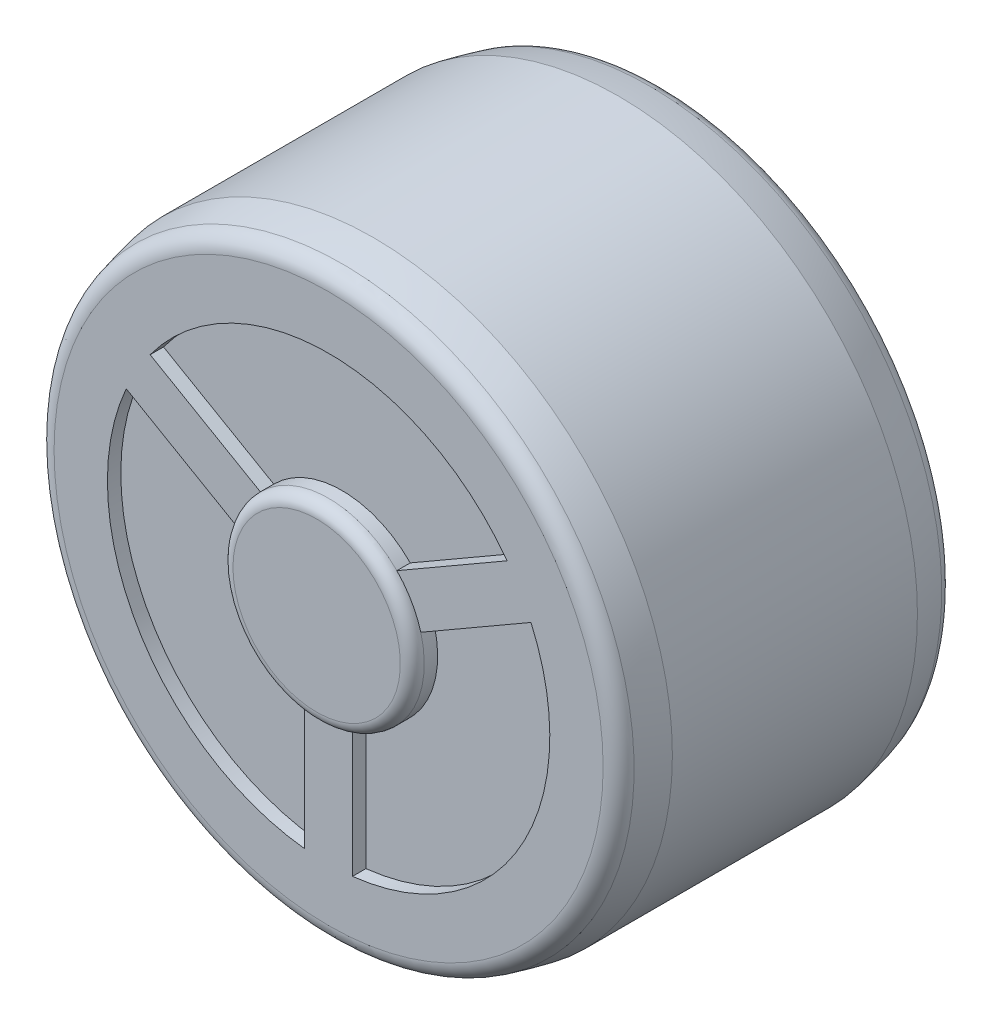
ISO-10303-21;
HEADER;
FILE_DESCRIPTION(('STEP AP214'),'2;1');
FILE_NAME('part.step','',(''),(''),'','','');
FILE_SCHEMA(('AUTOMOTIVE_DESIGN { 1 0 10303 214 1 1 1 1 }'));
ENDSEC;
DATA;
#1=APPLICATION_CONTEXT('core data for automotive mechanical design processes');
#2=APPLICATION_PROTOCOL_DEFINITION('international standard','automotive_design',2000,#1);
#3=PRODUCT_CONTEXT('',#1,'mechanical');
#4=PRODUCT('Part','Part','',(#3));
#5=PRODUCT_RELATED_PRODUCT_CATEGORY('part','',(#4));
#6=PRODUCT_DEFINITION_FORMATION('','',#4);
#7=PRODUCT_DEFINITION_CONTEXT('part definition',#1,'design');
#8=PRODUCT_DEFINITION('design','',#6,#7);
#9=PRODUCT_DEFINITION_SHAPE('','',#8);
#10=(LENGTH_UNIT() NAMED_UNIT(*) SI_UNIT(.MILLI.,.METRE.));
#11=(NAMED_UNIT(*) PLANE_ANGLE_UNIT() SI_UNIT($,.RADIAN.));
#12=(NAMED_UNIT(*) SI_UNIT($,.STERADIAN.) SOLID_ANGLE_UNIT());
#13=UNCERTAINTY_MEASURE_WITH_UNIT(LENGTH_MEASURE(1.E-05),#10,'distance_accuracy_value','');
#14=(GEOMETRIC_REPRESENTATION_CONTEXT(3) GLOBAL_UNCERTAINTY_ASSIGNED_CONTEXT((#13)) GLOBAL_UNIT_ASSIGNED_CONTEXT((#10,
#11,#12)) REPRESENTATION_CONTEXT('',''));
#15=CARTESIAN_POINT('',(0.,0.,0.));
#16=DIRECTION('',(0.,0.,1.));
#17=DIRECTION('',(1.,0.,0.));
#18=AXIS2_PLACEMENT_3D('',#15,#16,#17);
#19=CARTESIAN_POINT('',(0.,0.,-14.));
#20=DIRECTION('',(0.,0.,-1.));
#21=DIRECTION('',(-1.,0.,0.));
#22=AXIS2_PLACEMENT_3D('',#19,#20,#21);
#23=CYLINDRICAL_SURFACE('',#22,8.);
#24=DIRECTION('',(0.,0.,-1.));
#25=VECTOR('',#24,1.);
#26=CARTESIAN_POINT('',(-7.70820393249937,2.14093253863854,-14.));
#27=LINE('',#26,#25);
#28=CARTESIAN_POINT('',(-7.70820393249937,2.14093253863854,12.88));
#29=VERTEX_POINT('',#28);
#30=CARTESIAN_POINT('',(-7.70820393249937,2.14093253863854,14.));
#31=VERTEX_POINT('',#30);
#32=EDGE_CURVE('E186',#29,#31,#27,.F.);
#33=ORIENTED_EDGE('',*,*,#32,.F.);
#34=CARTESIAN_POINT('',(0.,0.,12.88));
#35=DIRECTION('',(0.,0.,-1.));
#36=DIRECTION('',(-1.,0.,0.));
#37=AXIS2_PLACEMENT_3D('',#34,#35,#36);
#38=CIRCLE('',#37,8.);
#39=CARTESIAN_POINT('',(-2.,-7.74596669241483,12.88));
#40=VERTEX_POINT('',#39);
#41=EDGE_CURVE('E220',#40,#29,#38,.T.);
#42=ORIENTED_EDGE('',*,*,#41,.F.);
#43=DIRECTION('',(0.,0.,-1.));
#44=VECTOR('',#43,1.);
#45=CARTESIAN_POINT('',(-2.,-7.74596669241483,-14.));
#46=LINE('',#45,#44);
#47=CARTESIAN_POINT('',(-2.,-7.74596669241483,14.));
#48=VERTEX_POINT('',#47);
#49=EDGE_CURVE('E336',#48,#40,#46,.T.);
#50=ORIENTED_EDGE('',*,*,#49,.F.);
#51=CARTESIAN_POINT('',(0.,0.,14.));
#52=DIRECTION('',(0.,0.,-1.));
#53=DIRECTION('',(-1.,0.,0.));
#54=AXIS2_PLACEMENT_3D('',#51,#52,#53);
#55=CIRCLE('',#54,8.);
#56=EDGE_CURVE('E229',#48,#31,#55,.T.);
#57=ORIENTED_EDGE('',*,*,#56,.T.);
#58=EDGE_LOOP('',(#33,#42,#50,#57));
#59=FACE_BOUND('',#58,.T.);
#60=ADVANCED_FACE('F17',(#59),#23,.T.);
#61=DIRECTION('',(0.,0.,-1.));
#62=VECTOR('',#61,1.);
#63=CARTESIAN_POINT('',(2.,-7.74596669241483,-14.));
#64=LINE('',#63,#62);
#65=CARTESIAN_POINT('',(2.,-7.74596669241483,12.88));
#66=VERTEX_POINT('',#65);
#67=CARTESIAN_POINT('',(2.,-7.74596669241483,14.));
#68=VERTEX_POINT('',#67);
#69=EDGE_CURVE('E327',#66,#68,#64,.F.);
#70=ORIENTED_EDGE('',*,*,#69,.F.);
#71=CARTESIAN_POINT('',(7.70820393249937,2.14093253863854,12.88));
#72=VERTEX_POINT('',#71);
#73=EDGE_CURVE('E222',#72,#66,#38,.T.);
#74=ORIENTED_EDGE('',*,*,#73,.F.);
#75=DIRECTION('',(0.,0.,-1.));
#76=VECTOR('',#75,1.);
#77=CARTESIAN_POINT('',(7.70820393249937,2.14093253863854,-14.));
#78=LINE('',#77,#76);
#79=CARTESIAN_POINT('',(7.70820393249937,2.14093253863854,14.));
#80=VERTEX_POINT('',#79);
#81=EDGE_CURVE('E319',#80,#72,#78,.T.);
#82=ORIENTED_EDGE('',*,*,#81,.F.);
#83=EDGE_CURVE('E234',#80,#68,#55,.T.);
#84=ORIENTED_EDGE('',*,*,#83,.T.);
#85=EDGE_LOOP('',(#70,#74,#82,#84));
#86=FACE_BOUND('',#85,.T.);
#87=ADVANCED_FACE('F401',(#86),#23,.T.);
#88=DIRECTION('',(0.,0.,-1.));
#89=VECTOR('',#88,1.);
#90=CARTESIAN_POINT('',(-5.70820393249937,5.60503415377629,-14.));
#91=LINE('',#90,#89);
#92=CARTESIAN_POINT('',(-5.70820393249937,5.60503415377629,14.));
#93=VERTEX_POINT('',#92);
#94=CARTESIAN_POINT('',(-5.70820393249937,5.60503415377629,12.88));
#95=VERTEX_POINT('',#94);
#96=EDGE_CURVE('E246',#93,#95,#91,.T.);
#97=ORIENTED_EDGE('',*,*,#96,.F.);
#98=CARTESIAN_POINT('',(5.70820393249937,5.6050341537763,14.));
#99=VERTEX_POINT('',#98);
#100=EDGE_CURVE('E25',#93,#99,#55,.T.);
#101=ORIENTED_EDGE('',*,*,#100,.T.);
#102=DIRECTION('',(0.,0.,-1.));
#103=VECTOR('',#102,1.);
#104=CARTESIAN_POINT('',(5.70820393249937,5.6050341537763,-14.));
#105=LINE('',#104,#103);
#106=CARTESIAN_POINT('',(5.70820393249937,5.6050341537763,12.88));
#107=VERTEX_POINT('',#106);
#108=EDGE_CURVE('E244',#107,#99,#105,.F.);
#109=ORIENTED_EDGE('',*,*,#108,.F.);
#110=EDGE_CURVE('E223',#95,#107,#38,.T.);
#111=ORIENTED_EDGE('',*,*,#110,.F.);
#112=EDGE_LOOP('',(#97,#101,#109,#111));
#113=FACE_BOUND('',#112,.T.);
#114=ADVANCED_FACE('F243',(#113),#23,.T.);
#115=CARTESIAN_POINT('',(0.,8.,12.88));
#116=DIRECTION('',(0.,0.,-1.));
#117=DIRECTION('',(-1.,0.,0.));
#118=AXIS2_PLACEMENT_3D('',#115,#116,#117);
#119=PLANE('',#118);
#120=DIRECTION('',(0.866025403784439,-0.5,0.));
#121=VECTOR('',#120,1.);
#122=CARTESIAN_POINT('',(-4.46410161513775,0.267949192431121,12.88));
#123=LINE('',#122,#121);
#124=CARTESIAN_POINT('',(-16.9275704361965,7.46373627130588,12.88));
#125=VERTEX_POINT('',#124);
#126=EDGE_CURVE('E342',#125,#29,#123,.T.);
#127=ORIENTED_EDGE('',*,*,#126,.F.);
#128=CARTESIAN_POINT('',(0.,0.,12.88));
#129=DIRECTION('',(0.,0.,-1.));
#130=DIRECTION('',(-1.,0.,0.));
#131=AXIS2_PLACEMENT_3D('',#128,#129,#130);
#132=CIRCLE('',#131,18.5);
#133=CARTESIAN_POINT('',(-2.,-18.3915741577495,12.88));
#134=VERTEX_POINT('',#133);
#135=EDGE_CURVE('E200',#134,#125,#132,.T.);
#136=ORIENTED_EDGE('',*,*,#135,.F.);
#137=DIRECTION('',(0.,-1.,0.));
#138=VECTOR('',#137,1.);
#139=CARTESIAN_POINT('',(-2.,8.,12.88));
#140=LINE('',#139,#138);
#141=EDGE_CURVE('E334',#40,#134,#140,.T.);
#142=ORIENTED_EDGE('',*,*,#141,.F.);
#143=ORIENTED_EDGE('',*,*,#41,.T.);
#144=EDGE_LOOP('',(#127,#136,#142,#143));
#145=FACE_BOUND('',#144,.T.);
#146=ADVANCED_FACE('F409',(#145),#119,.F.);
#147=DIRECTION('',(0.,1.,0.));
#148=VECTOR('',#147,1.);
#149=CARTESIAN_POINT('',(2.,8.,12.88));
#150=LINE('',#149,#148);
#151=CARTESIAN_POINT('',(2.,-18.3915741577495,12.88));
#152=VERTEX_POINT('',#151);
#153=EDGE_CURVE('E325',#152,#66,#150,.T.);
#154=ORIENTED_EDGE('',*,*,#153,.F.);
#155=CARTESIAN_POINT('',(16.9275704361965,7.46373627130589,12.88));
#156=VERTEX_POINT('',#155);
#157=EDGE_CURVE('E215',#156,#152,#132,.T.);
#158=ORIENTED_EDGE('',*,*,#157,.F.);
#159=DIRECTION('',(0.866025403784438,0.5,0.));
#160=VECTOR('',#159,1.);
#161=CARTESIAN_POINT('',(4.46410161513776,0.267949192431126,12.88));
#162=LINE('',#161,#160);
#163=EDGE_CURVE('E317',#72,#156,#162,.T.);
#164=ORIENTED_EDGE('',*,*,#163,.F.);
#165=ORIENTED_EDGE('',*,*,#73,.T.);
#166=EDGE_LOOP('',(#154,#158,#164,#165));
#167=FACE_BOUND('',#166,.T.);
#168=ADVANCED_FACE('F413',(#167),#119,.F.);
#169=DIRECTION('',(-0.866025403784439,0.5,0.));
#170=VECTOR('',#169,1.);
#171=CARTESIAN_POINT('',(-2.46410161513776,3.73205080756888,12.88));
#172=LINE('',#171,#170);
#173=CARTESIAN_POINT('',(-14.9275704361965,10.9278378864436,12.88));
#174=VERTEX_POINT('',#173);
#175=EDGE_CURVE('E302',#95,#174,#172,.T.);
#176=ORIENTED_EDGE('',*,*,#175,.F.);
#177=ORIENTED_EDGE('',*,*,#110,.T.);
#178=DIRECTION('',(-0.866025403784439,-0.5,0.));
#179=VECTOR('',#178,1.);
#180=CARTESIAN_POINT('',(2.46410161513776,3.73205080756888,12.88));
#181=LINE('',#180,#179);
#182=CARTESIAN_POINT('',(14.9275704361965,10.9278378864436,12.88));
#183=VERTEX_POINT('',#182);
#184=EDGE_CURVE('E309',#183,#107,#181,.T.);
#185=ORIENTED_EDGE('',*,*,#184,.F.);
#186=EDGE_CURVE('E216',#174,#183,#132,.T.);
#187=ORIENTED_EDGE('',*,*,#186,.F.);
#188=EDGE_LOOP('',(#176,#177,#185,#187));
#189=FACE_BOUND('',#188,.T.);
#190=ADVANCED_FACE('F414',(#189),#119,.F.);
#191=CARTESIAN_POINT('',(0.,0.,-14.));
#192=DIRECTION('',(0.,0.,-1.));
#193=DIRECTION('',(-1.,0.,0.));
#194=AXIS2_PLACEMENT_3D('',#191,#192,#193);
#195=CYLINDRICAL_SURFACE('',#194,18.5);
#196=DIRECTION('',(0.,0.,-1.));
#197=VECTOR('',#196,1.);
#198=CARTESIAN_POINT('',(-16.9275704361965,7.46373627130588,14.));
#199=LINE('',#198,#197);
#200=CARTESIAN_POINT('',(-16.9275704361965,7.46373627130588,14.));
#201=VERTEX_POINT('',#200);
#202=EDGE_CURVE('E183',#201,#125,#199,.T.);
#203=ORIENTED_EDGE('',*,*,#202,.F.);
#204=CARTESIAN_POINT('',(0.,0.,14.));
#205=DIRECTION('',(0.,0.,-1.));
#206=DIRECTION('',(-1.,0.,0.));
#207=AXIS2_PLACEMENT_3D('',#204,#205,#206);
#208=CIRCLE('',#207,18.5);
#209=CARTESIAN_POINT('',(-2.,-18.3915741577495,14.));
#210=VERTEX_POINT('',#209);
#211=EDGE_CURVE('E198',#210,#201,#208,.T.);
#212=ORIENTED_EDGE('',*,*,#211,.F.);
#213=DIRECTION('',(0.,0.,-1.));
#214=VECTOR('',#213,1.);
#215=CARTESIAN_POINT('',(-2.,-18.3915741577495,14.));
#216=LINE('',#215,#214);
#217=EDGE_CURVE('E40',#210,#134,#216,.T.);
#218=ORIENTED_EDGE('',*,*,#217,.T.);
#219=ORIENTED_EDGE('',*,*,#135,.T.);
#220=EDGE_LOOP('',(#203,#212,#218,#219));
#221=FACE_BOUND('',#220,.T.);
#222=ADVANCED_FACE('F197',(#221),#195,.F.);
#223=DIRECTION('',(0.,0.,-1.));
#224=VECTOR('',#223,1.);
#225=CARTESIAN_POINT('',(2.,-18.3915741577495,14.));
#226=LINE('',#225,#224);
#227=CARTESIAN_POINT('',(2.,-18.3915741577495,14.));
#228=VERTEX_POINT('',#227);
#229=EDGE_CURVE('E293',#228,#152,#226,.T.);
#230=ORIENTED_EDGE('',*,*,#229,.F.);
#231=CARTESIAN_POINT('',(16.9275704361965,7.46373627130589,14.));
#232=VERTEX_POINT('',#231);
#233=EDGE_CURVE('E206',#232,#228,#208,.T.);
#234=ORIENTED_EDGE('',*,*,#233,.F.);
#235=DIRECTION('',(0.,0.,-1.));
#236=VECTOR('',#235,1.);
#237=CARTESIAN_POINT('',(16.9275704361965,7.46373627130589,14.));
#238=LINE('',#237,#236);
#239=EDGE_CURVE('E289',#232,#156,#238,.T.);
#240=ORIENTED_EDGE('',*,*,#239,.T.);
#241=ORIENTED_EDGE('',*,*,#157,.T.);
#242=EDGE_LOOP('',(#230,#234,#240,#241));
#243=FACE_BOUND('',#242,.T.);
#244=ADVANCED_FACE('F424',(#243),#195,.F.);
#245=DIRECTION('',(0.,0.,-1.));
#246=VECTOR('',#245,1.);
#247=CARTESIAN_POINT('',(-14.9275704361965,10.9278378864436,14.));
#248=LINE('',#247,#246);
#249=CARTESIAN_POINT('',(-14.9275704361965,10.9278378864436,14.));
#250=VERTEX_POINT('',#249);
#251=EDGE_CURVE('E260',#250,#174,#248,.T.);
#252=ORIENTED_EDGE('',*,*,#251,.T.);
#253=ORIENTED_EDGE('',*,*,#186,.T.);
#254=DIRECTION('',(0.,0.,-1.));
#255=VECTOR('',#254,1.);
#256=CARTESIAN_POINT('',(14.9275704361965,10.9278378864436,14.));
#257=LINE('',#256,#255);
#258=CARTESIAN_POINT('',(14.9275704361965,10.9278378864436,14.));
#259=VERTEX_POINT('',#258);
#260=EDGE_CURVE('E286',#259,#183,#257,.T.);
#261=ORIENTED_EDGE('',*,*,#260,.F.);
#262=EDGE_CURVE('E32',#250,#259,#208,.T.);
#263=ORIENTED_EDGE('',*,*,#262,.F.);
#264=EDGE_LOOP('',(#252,#253,#261,#263));
#265=FACE_BOUND('',#264,.T.);
#266=ADVANCED_FACE('F425',(#265),#195,.F.);
#267=CARTESIAN_POINT('',(0.,0.,-14.));
#268=DIRECTION('',(0.,0.,-1.));
#269=DIRECTION('',(-1.,0.,0.));
#270=AXIS2_PLACEMENT_3D('',#267,#268,#269);
#271=CYLINDRICAL_SURFACE('',#270,18.5);
#272=CARTESIAN_POINT('',(-16.9275704361965,7.46373627130588,-12.88));
#273=VERTEX_POINT('',#272);
#274=CARTESIAN_POINT('',(-16.9275704361965,7.46373627130588,-14.));
#275=VERTEX_POINT('',#274);
#276=EDGE_CURVE('E202',#273,#275,#199,.T.);
#277=ORIENTED_EDGE('',*,*,#276,.F.);
#278=CARTESIAN_POINT('',(0.,0.,-12.88));
#279=DIRECTION('',(0.,0.,-1.));
#280=DIRECTION('',(-1.,0.,0.));
#281=AXIS2_PLACEMENT_3D('',#278,#279,#280);
#282=CIRCLE('',#281,18.5);
#283=CARTESIAN_POINT('',(-2.,-18.3915741577495,-12.88));
#284=VERTEX_POINT('',#283);
#285=EDGE_CURVE('E358',#284,#273,#282,.T.);
#286=ORIENTED_EDGE('',*,*,#285,.F.);
#287=CARTESIAN_POINT('',(-2.,-18.3915741577495,-14.));
#288=VERTEX_POINT('',#287);
#289=EDGE_CURVE('E295',#284,#288,#216,.T.);
#290=ORIENTED_EDGE('',*,*,#289,.T.);
#291=CARTESIAN_POINT('',(0.,0.,-14.));
#292=DIRECTION('',(0.,0.,-1.));
#293=DIRECTION('',(-1.,0.,0.));
#294=AXIS2_PLACEMENT_3D('',#291,#292,#293);
#295=CIRCLE('',#294,18.5);
#296=EDGE_CURVE('E363',#288,#275,#295,.T.);
#297=ORIENTED_EDGE('',*,*,#296,.T.);
#298=EDGE_LOOP('',(#277,#286,#290,#297));
#299=FACE_BOUND('',#298,.T.);
#300=ADVANCED_FACE('F427',(#299),#271,.F.);
#301=CARTESIAN_POINT('',(2.,-18.3915741577495,-12.88));
#302=VERTEX_POINT('',#301);
#303=CARTESIAN_POINT('',(2.,-18.3915741577495,-14.));
#304=VERTEX_POINT('',#303);
#305=EDGE_CURVE('E292',#302,#304,#226,.T.);
#306=ORIENTED_EDGE('',*,*,#305,.F.);
#307=CARTESIAN_POINT('',(16.9275704361965,7.46373627130589,-12.88));
#308=VERTEX_POINT('',#307);
#309=EDGE_CURVE('E364',#308,#302,#282,.T.);
#310=ORIENTED_EDGE('',*,*,#309,.F.);
#311=CARTESIAN_POINT('',(16.9275704361965,7.46373627130589,-14.));
#312=VERTEX_POINT('',#311);
#313=EDGE_CURVE('E288',#308,#312,#238,.T.);
#314=ORIENTED_EDGE('',*,*,#313,.T.);
#315=EDGE_CURVE('E369',#312,#304,#295,.T.);
#316=ORIENTED_EDGE('',*,*,#315,.T.);
#317=EDGE_LOOP('',(#306,#310,#314,#316));
#318=FACE_BOUND('',#317,.T.);
#319=ADVANCED_FACE('F432',(#318),#271,.F.);
#320=CARTESIAN_POINT('',(-14.9275704361965,10.9278378864436,-12.88));
#321=VERTEX_POINT('',#320);
#322=CARTESIAN_POINT('',(-14.9275704361965,10.9278378864436,-14.));
#323=VERTEX_POINT('',#322);
#324=EDGE_CURVE('E261',#321,#323,#248,.T.);
#325=ORIENTED_EDGE('',*,*,#324,.T.);
#326=CARTESIAN_POINT('',(14.9275704361965,10.9278378864436,-14.));
#327=VERTEX_POINT('',#326);
#328=EDGE_CURVE('E365',#323,#327,#295,.T.);
#329=ORIENTED_EDGE('',*,*,#328,.T.);
#330=CARTESIAN_POINT('',(14.9275704361965,10.9278378864436,-12.88));
#331=VERTEX_POINT('',#330);
#332=EDGE_CURVE('E285',#331,#327,#257,.T.);
#333=ORIENTED_EDGE('',*,*,#332,.F.);
#334=EDGE_CURVE('E360',#321,#331,#282,.T.);
#335=ORIENTED_EDGE('',*,*,#334,.F.);
#336=EDGE_LOOP('',(#325,#329,#333,#335));
#337=FACE_BOUND('',#336,.T.);
#338=ADVANCED_FACE('F435',(#337),#271,.F.);
#339=CARTESIAN_POINT('',(0.,18.5,-12.88));
#340=DIRECTION('',(0.,0.,1.));
#341=DIRECTION('',(1.,0.,0.));
#342=AXIS2_PLACEMENT_3D('',#339,#340,#341);
#343=PLANE('',#342);
#344=DIRECTION('',(-0.866025403784439,0.5,0.));
#345=VECTOR('',#344,1.);
#346=CARTESIAN_POINT('',(-9.01073498500605,2.89294919243112,-12.88));
#347=LINE('',#346,#345);
#348=CARTESIAN_POINT('',(-7.70820393249937,2.14093253863854,-12.88));
#349=VERTEX_POINT('',#348);
#350=EDGE_CURVE('E340',#349,#273,#347,.T.);
#351=ORIENTED_EDGE('',*,*,#350,.F.);
#352=CARTESIAN_POINT('',(0.,0.,-12.88));
#353=DIRECTION('',(0.,0.,-1.));
#354=DIRECTION('',(-1.,0.,0.));
#355=AXIS2_PLACEMENT_3D('',#352,#353,#354);
#356=CIRCLE('',#355,8.);
#357=CARTESIAN_POINT('',(-2.,-7.74596669241483,-12.88));
#358=VERTEX_POINT('',#357);
#359=EDGE_CURVE('E353',#358,#349,#356,.T.);
#360=ORIENTED_EDGE('',*,*,#359,.F.);
#361=DIRECTION('',(0.,1.,0.));
#362=VECTOR('',#361,1.);
#363=CARTESIAN_POINT('',(-2.,18.5,-12.88));
#364=LINE('',#363,#362);
#365=EDGE_CURVE('E332',#284,#358,#364,.T.);
#366=ORIENTED_EDGE('',*,*,#365,.F.);
#367=ORIENTED_EDGE('',*,*,#285,.T.);
#368=EDGE_LOOP('',(#351,#360,#366,#367));
#369=FACE_BOUND('',#368,.T.);
#370=ADVANCED_FACE('F490',(#369),#343,.F.);
#371=DIRECTION('',(0.,-1.,0.));
#372=VECTOR('',#371,1.);
#373=CARTESIAN_POINT('',(2.,18.5,-12.88));
#374=LINE('',#373,#372);
#375=CARTESIAN_POINT('',(2.,-7.74596669241483,-12.88));
#376=VERTEX_POINT('',#375);
#377=EDGE_CURVE('E323',#376,#302,#374,.T.);
#378=ORIENTED_EDGE('',*,*,#377,.F.);
#379=CARTESIAN_POINT('',(7.70820393249937,2.14093253863854,-12.88));
#380=VERTEX_POINT('',#379);
#381=EDGE_CURVE('E359',#380,#376,#356,.T.);
#382=ORIENTED_EDGE('',*,*,#381,.F.);
#383=DIRECTION('',(-0.866025403784438,-0.5,0.));
#384=VECTOR('',#383,1.);
#385=CARTESIAN_POINT('',(9.01073498500606,2.89294919243113,-12.88));
#386=LINE('',#385,#384);
#387=EDGE_CURVE('E315',#308,#380,#386,.T.);
#388=ORIENTED_EDGE('',*,*,#387,.F.);
#389=ORIENTED_EDGE('',*,*,#309,.T.);
#390=EDGE_LOOP('',(#378,#382,#388,#389));
#391=FACE_BOUND('',#390,.T.);
#392=ADVANCED_FACE('F498',(#391),#343,.F.);
#393=DIRECTION('',(0.866025403784439,-0.5,0.));
#394=VECTOR('',#393,1.);
#395=CARTESIAN_POINT('',(-7.01073498500606,6.35705080756887,-12.88));
#396=LINE('',#395,#394);
#397=CARTESIAN_POINT('',(-5.70820393249937,5.60503415377629,-12.88));
#398=VERTEX_POINT('',#397);
#399=EDGE_CURVE('E299',#321,#398,#396,.T.);
#400=ORIENTED_EDGE('',*,*,#399,.F.);
#401=ORIENTED_EDGE('',*,*,#334,.T.);
#402=DIRECTION('',(0.866025403784439,0.5,0.));
#403=VECTOR('',#402,1.);
#404=CARTESIAN_POINT('',(7.01073498500606,6.35705080756888,-12.88));
#405=LINE('',#404,#403);
#406=CARTESIAN_POINT('',(5.70820393249937,5.6050341537763,-12.88));
#407=VERTEX_POINT('',#406);
#408=EDGE_CURVE('E307',#407,#331,#405,.T.);
#409=ORIENTED_EDGE('',*,*,#408,.F.);
#410=EDGE_CURVE('E355',#398,#407,#356,.T.);
#411=ORIENTED_EDGE('',*,*,#410,.F.);
#412=EDGE_LOOP('',(#400,#401,#409,#411));
#413=FACE_BOUND('',#412,.T.);
#414=ADVANCED_FACE('F545',(#413),#343,.F.);
#415=CARTESIAN_POINT('',(0.,0.,-14.));
#416=DIRECTION('',(0.,0.,-1.));
#417=DIRECTION('',(-1.,0.,0.));
#418=AXIS2_PLACEMENT_3D('',#415,#416,#417);
#419=CYLINDRICAL_SURFACE('',#418,8.);
#420=DIRECTION('',(0.,0.,-1.));
#421=VECTOR('',#420,1.);
#422=CARTESIAN_POINT('',(-7.70820393249937,2.14093253863854,-14.));
#423=LINE('',#422,#421);
#424=CARTESIAN_POINT('',(-7.70820393249937,2.14093253863854,-14.));
#425=VERTEX_POINT('',#424);
#426=EDGE_CURVE('E338',#425,#349,#423,.F.);
#427=ORIENTED_EDGE('',*,*,#426,.F.);
#428=CARTESIAN_POINT('',(0.,0.,-14.));
#429=DIRECTION('',(0.,0.,-1.));
#430=DIRECTION('',(-1.,0.,0.));
#431=AXIS2_PLACEMENT_3D('',#428,#429,#430);
#432=CIRCLE('',#431,8.);
#433=CARTESIAN_POINT('',(-2.,-7.74596669241483,-14.));
#434=VERTEX_POINT('',#433);
#435=EDGE_CURVE('E517',#434,#425,#432,.T.);
#436=ORIENTED_EDGE('',*,*,#435,.F.);
#437=DIRECTION('',(0.,0.,-1.));
#438=VECTOR('',#437,1.);
#439=CARTESIAN_POINT('',(-2.,-7.74596669241483,-14.));
#440=LINE('',#439,#438);
#441=EDGE_CURVE('E329',#358,#434,#440,.T.);
#442=ORIENTED_EDGE('',*,*,#441,.F.);
#443=ORIENTED_EDGE('',*,*,#359,.T.);
#444=EDGE_LOOP('',(#427,#436,#442,#443));
#445=FACE_BOUND('',#444,.T.);
#446=ADVANCED_FACE('F528',(#445),#419,.T.);
#447=DIRECTION('',(0.,0.,-1.));
#448=VECTOR('',#447,1.);
#449=CARTESIAN_POINT('',(2.,-7.74596669241483,-14.));
#450=LINE('',#449,#448);
#451=CARTESIAN_POINT('',(2.,-7.74596669241483,-14.));
#452=VERTEX_POINT('',#451);
#453=EDGE_CURVE('E321',#452,#376,#450,.F.);
#454=ORIENTED_EDGE('',*,*,#453,.F.);
#455=CARTESIAN_POINT('',(7.70820393249937,2.14093253863854,-14.));
#456=VERTEX_POINT('',#455);
#457=EDGE_CURVE('E516',#456,#452,#432,.T.);
#458=ORIENTED_EDGE('',*,*,#457,.F.);
#459=DIRECTION('',(0.,0.,-1.));
#460=VECTOR('',#459,1.);
#461=CARTESIAN_POINT('',(7.70820393249937,2.14093253863854,-14.));
#462=LINE('',#461,#460);
#463=EDGE_CURVE('E312',#380,#456,#462,.T.);
#464=ORIENTED_EDGE('',*,*,#463,.F.);
#465=ORIENTED_EDGE('',*,*,#381,.T.);
#466=EDGE_LOOP('',(#454,#458,#464,#465));
#467=FACE_BOUND('',#466,.T.);
#468=ADVANCED_FACE('F531',(#467),#419,.T.);
#469=DIRECTION('',(0.,0.,-1.));
#470=VECTOR('',#469,1.);
#471=CARTESIAN_POINT('',(-5.70820393249937,5.60503415377629,-14.));
#472=LINE('',#471,#470);
#473=CARTESIAN_POINT('',(-5.70820393249937,5.60503415377629,-14.));
#474=VERTEX_POINT('',#473);
#475=EDGE_CURVE('E201',#398,#474,#472,.T.);
#476=ORIENTED_EDGE('',*,*,#475,.F.);
#477=ORIENTED_EDGE('',*,*,#410,.T.);
#478=DIRECTION('',(0.,0.,-1.));
#479=VECTOR('',#478,1.);
#480=CARTESIAN_POINT('',(5.70820393249937,5.6050341537763,-14.));
#481=LINE('',#480,#479);
#482=CARTESIAN_POINT('',(5.70820393249937,5.6050341537763,-14.));
#483=VERTEX_POINT('',#482);
#484=EDGE_CURVE('E305',#483,#407,#481,.F.);
#485=ORIENTED_EDGE('',*,*,#484,.F.);
#486=EDGE_CURVE('E350',#474,#483,#432,.T.);
#487=ORIENTED_EDGE('',*,*,#486,.F.);
#488=EDGE_LOOP('',(#476,#477,#485,#487));
#489=FACE_BOUND('',#488,.T.);
#490=ADVANCED_FACE('F542',(#489),#419,.T.);
#491=CARTESIAN_POINT('',(0.,0.,15.));
#492=DIRECTION('',(0.,0.,-1.));
#493=DIRECTION('',(-1.,0.,0.));
#494=AXIS2_PLACEMENT_3D('',#491,#492,#493);
#495=PLANE('',#494);
#496=CARTESIAN_POINT('',(0.,0.,15.));
#497=DIRECTION('',(0.,0.,-1.));
#498=DIRECTION('',(-1.,0.,0.));
#499=AXIS2_PLACEMENT_3D('',#496,#497,#498);
#500=CIRCLE('',#499,7.);
#501=CARTESIAN_POINT('',(-7.,0.,15.));
#502=VERTEX_POINT('',#501);
#503=EDGE_CURVE('E11',#502,#502,#500,.T.);
#504=ORIENTED_EDGE('',*,*,#503,.F.);
#505=EDGE_LOOP('',(#504));
#506=FACE_BOUND('',#505,.T.);
#507=ADVANCED_FACE('F19',(#506),#495,.F.);
#508=CARTESIAN_POINT('',(0.,0.,14.));
#509=DIRECTION('',(0.,0.,-1.));
#510=DIRECTION('',(-1.,0.,0.));
#511=AXIS2_PLACEMENT_3D('',#508,#509,#510);
#512=TOROIDAL_SURFACE('',#511,7.,0.999999999999997);
#513=ORIENTED_EDGE('',*,*,#503,.T.);
#514=EDGE_LOOP('',(#513));
#515=FACE_BOUND('',#514,.T.);
#516=ORIENTED_EDGE('',*,*,#100,.F.);
#517=CARTESIAN_POINT('',(0.,0.,14.));
#518=DIRECTION('',(0.,0.,1.));
#519=DIRECTION('',(1.,0.,0.));
#520=AXIS2_PLACEMENT_3D('',#517,#518,#519);
#521=CIRCLE('',#520,8.);
#522=EDGE_CURVE('E250',#93,#31,#521,.T.);
#523=ORIENTED_EDGE('',*,*,#522,.T.);
#524=ORIENTED_EDGE('',*,*,#56,.F.);
#525=EDGE_CURVE('E255',#48,#68,#521,.T.);
#526=ORIENTED_EDGE('',*,*,#525,.T.);
#527=ORIENTED_EDGE('',*,*,#83,.F.);
#528=EDGE_CURVE('E252',#80,#99,#521,.T.);
#529=ORIENTED_EDGE('',*,*,#528,.T.);
#530=EDGE_LOOP('',(#516,#523,#524,#526,#527,#529));
#531=FACE_BOUND('',#530,.T.);
#532=ADVANCED_FACE('F249',(#515,#531),#512,.T.);
#533=CARTESIAN_POINT('',(0.,18.5,14.));
#534=DIRECTION('',(0.,0.,-1.));
#535=DIRECTION('',(-1.,0.,0.));
#536=AXIS2_PLACEMENT_3D('',#533,#534,#535);
#537=PLANE('',#536);
#538=CARTESIAN_POINT('',(0.,0.,14.));
#539=DIRECTION('',(0.,0.,-1.));
#540=DIRECTION('',(-1.,0.,0.));
#541=AXIS2_PLACEMENT_3D('',#538,#539,#540);
#542=CIRCLE('',#541,22.9599839871872);
#543=CARTESIAN_POINT('',(-22.9599839871872,0.,14.));
#544=VERTEX_POINT('',#543);
#545=EDGE_CURVE('E207',#544,#544,#542,.T.);
#546=ORIENTED_EDGE('',*,*,#545,.F.);
#547=EDGE_LOOP('',(#546));
#548=FACE_BOUND('',#547,.T.);
#549=DIRECTION('',(-0.866025403784439,0.5,0.));
#550=VECTOR('',#549,1.);
#551=CARTESIAN_POINT('',(-2.,3.46410161513775,14.));
#552=LINE('',#551,#550);
#553=EDGE_CURVE('E254',#93,#250,#552,.T.);
#554=ORIENTED_EDGE('',*,*,#553,.T.);
#555=ORIENTED_EDGE('',*,*,#262,.T.);
#556=DIRECTION('',(-0.866025403784438,-0.5,0.));
#557=VECTOR('',#556,1.);
#558=CARTESIAN_POINT('',(14.9275704361965,10.9278378864436,14.));
#559=LINE('',#558,#557);
#560=EDGE_CURVE('E262',#259,#99,#559,.T.);
#561=ORIENTED_EDGE('',*,*,#560,.T.);
#562=ORIENTED_EDGE('',*,*,#528,.F.);
#563=DIRECTION('',(0.866025403784438,0.5,0.));
#564=VECTOR('',#563,1.);
#565=CARTESIAN_POINT('',(4.,0.,14.));
#566=LINE('',#565,#564);
#567=EDGE_CURVE('E266',#80,#232,#566,.T.);
#568=ORIENTED_EDGE('',*,*,#567,.T.);
#569=ORIENTED_EDGE('',*,*,#233,.T.);
#570=DIRECTION('',(0.,1.,0.));
#571=VECTOR('',#570,1.);
#572=CARTESIAN_POINT('',(2.,-18.3915741577495,14.));
#573=LINE('',#572,#571);
#574=EDGE_CURVE('E446',#228,#68,#573,.T.);
#575=ORIENTED_EDGE('',*,*,#574,.T.);
#576=ORIENTED_EDGE('',*,*,#525,.F.);
#577=DIRECTION('',(0.,-1.,0.));
#578=VECTOR('',#577,1.);
#579=CARTESIAN_POINT('',(-2.,-3.46410161513775,14.));
#580=LINE('',#579,#578);
#581=EDGE_CURVE('E191',#48,#210,#580,.T.);
#582=ORIENTED_EDGE('',*,*,#581,.T.);
#583=ORIENTED_EDGE('',*,*,#211,.T.);
#584=DIRECTION('',(0.866025403784439,-0.5,0.));
#585=VECTOR('',#584,1.);
#586=CARTESIAN_POINT('',(-16.9275704361965,7.46373627130588,14.));
#587=LINE('',#586,#585);
#588=EDGE_CURVE('E180',#201,#31,#587,.T.);
#589=ORIENTED_EDGE('',*,*,#588,.T.);
#590=ORIENTED_EDGE('',*,*,#522,.F.);
#591=EDGE_LOOP('',(#554,#555,#561,#562,#568,#569,#575,#576,#582,#583,#589,#590));
#592=FACE_BOUND('',#591,.T.);
#593=ADVANCED_FACE('F205',(#548,#592),#537,.F.);
#594=CARTESIAN_POINT('',(0.,0.,12.5));
#595=DIRECTION('',(0.,0.,-1.));
#596=DIRECTION('',(-1.,0.,0.));
#597=AXIS2_PLACEMENT_3D('',#594,#595,#596);
#598=TOROIDAL_SURFACE('',#597,22.9599839871872,1.5);
#599=ORIENTED_EDGE('',*,*,#545,.T.);
#600=EDGE_LOOP('',(#599));
#601=FACE_BOUND('',#600,.T.);
#602=CARTESIAN_POINT('',(0.,0.,12.8640776699029));
#603=DIRECTION('',(0.,0.,-1.));
#604=DIRECTION('',(-1.,0.,0.));
#605=AXIS2_PLACEMENT_3D('',#602,#603,#604);
#606=CIRCLE('',#605,24.4151291518625);
#607=CARTESIAN_POINT('',(-24.4151291518625,0.,12.8640776699029));
#608=VERTEX_POINT('',#607);
#609=EDGE_CURVE('E211',#608,#608,#606,.T.);
#610=ORIENTED_EDGE('',*,*,#609,.F.);
#611=EDGE_LOOP('',(#610));
#612=FACE_BOUND('',#611,.T.);
#613=ADVANCED_FACE('F387',(#601,#612),#598,.T.);
#614=CARTESIAN_POINT('',(0.,0.,-5.08100506113607E-12));
#615=DIRECTION('',(0.,0.,-1.));
#616=DIRECTION('',(-1.,0.,0.));
#617=AXIS2_PLACEMENT_3D('',#614,#615,#616);
#618=DEGENERATE_TOROIDAL_SURFACE('',#617,27.0000000000225,53.0000000000231,.F.);
#619=ORIENTED_EDGE('',*,*,#609,.T.);
#620=EDGE_LOOP('',(#619));
#621=FACE_BOUND('',#620,.T.);
#622=CARTESIAN_POINT('',(0.,0.,10.2469507659596));
#623=DIRECTION('',(0.,0.,-1.));
#624=DIRECTION('',(-1.,0.,0.));
#625=AXIS2_PLACEMENT_3D('',#622,#623,#624);
#626=CIRCLE('',#625,25.);
#627=CARTESIAN_POINT('',(-25.,0.,10.2469507659596));
#628=VERTEX_POINT('',#627);
#629=EDGE_CURVE('E378',#628,#628,#626,.T.);
#630=ORIENTED_EDGE('',*,*,#629,.F.);
#631=EDGE_LOOP('',(#630));
#632=FACE_BOUND('',#631,.T.);
#633=ADVANCED_FACE('F384',(#621,#632),#618,.F.);
#634=CARTESIAN_POINT('',(0.,0.,-14.));
#635=DIRECTION('',(0.,0.,-1.));
#636=DIRECTION('',(-1.,0.,0.));
#637=AXIS2_PLACEMENT_3D('',#634,#635,#636);
#638=CYLINDRICAL_SURFACE('',#637,25.);
#639=CARTESIAN_POINT('',(0.,0.,-10.2469507659596));
#640=DIRECTION('',(0.,0.,-1.));
#641=DIRECTION('',(-1.,0.,0.));
#642=AXIS2_PLACEMENT_3D('',#639,#640,#641);
#643=CIRCLE('',#642,25.);
#644=CARTESIAN_POINT('',(-25.,0.,-10.2469507659596));
#645=VERTEX_POINT('',#644);
#646=EDGE_CURVE('E375',#645,#645,#643,.T.);
#647=ORIENTED_EDGE('',*,*,#646,.F.);
#648=EDGE_LOOP('',(#647));
#649=FACE_BOUND('',#648,.T.);
#650=ORIENTED_EDGE('',*,*,#629,.T.);
#651=EDGE_LOOP('',(#650));
#652=FACE_BOUND('',#651,.T.);
#653=ADVANCED_FACE('F396',(#649,#652),#638,.T.);
#654=CARTESIAN_POINT('',(0.,0.,2.55177823316188E-12));
#655=DIRECTION('',(0.,0.,-1.));
#656=DIRECTION('',(-1.,0.,0.));
#657=AXIS2_PLACEMENT_3D('',#654,#655,#656);
#658=DEGENERATE_TOROIDAL_SURFACE('',#657,27.0000000000115,53.0000000000118,.F.);
#659=ORIENTED_EDGE('',*,*,#646,.T.);
#660=EDGE_LOOP('',(#659));
#661=FACE_BOUND('',#660,.T.);
#662=CARTESIAN_POINT('',(0.,0.,-12.8640776699029));
#663=DIRECTION('',(0.,0.,-1.));
#664=DIRECTION('',(-1.,0.,0.));
#665=AXIS2_PLACEMENT_3D('',#662,#663,#664);
#666=CIRCLE('',#665,24.4151291518626);
#667=CARTESIAN_POINT('',(-24.4151291518626,0.,-12.8640776699029));
#668=VERTEX_POINT('',#667);
#669=EDGE_CURVE('E372',#668,#668,#666,.T.);
#670=ORIENTED_EDGE('',*,*,#669,.F.);
#671=EDGE_LOOP('',(#670));
#672=FACE_BOUND('',#671,.T.);
#673=ADVANCED_FACE('F563',(#661,#672),#658,.F.);
#674=CARTESIAN_POINT('',(0.,0.,-12.5));
#675=DIRECTION('',(0.,0.,-1.));
#676=DIRECTION('',(-1.,0.,0.));
#677=AXIS2_PLACEMENT_3D('',#674,#675,#676);
#678=TOROIDAL_SURFACE('',#677,22.9599839871872,1.50000000000001);
#679=ORIENTED_EDGE('',*,*,#669,.T.);
#680=EDGE_LOOP('',(#679));
#681=FACE_BOUND('',#680,.T.);
#682=CARTESIAN_POINT('',(0.,0.,-14.));
#683=DIRECTION('',(0.,0.,-1.));
#684=DIRECTION('',(-1.,0.,0.));
#685=AXIS2_PLACEMENT_3D('',#682,#683,#684);
#686=CIRCLE('',#685,22.9599839871872);
#687=CARTESIAN_POINT('',(-22.9599839871872,0.,-14.));
#688=VERTEX_POINT('',#687);
#689=EDGE_CURVE('E368',#688,#688,#686,.T.);
#690=ORIENTED_EDGE('',*,*,#689,.F.);
#691=EDGE_LOOP('',(#690));
#692=FACE_BOUND('',#691,.T.);
#693=ADVANCED_FACE('F560',(#681,#692),#678,.T.);
#694=CARTESIAN_POINT('',(0.,22.9599839871872,-14.));
#695=DIRECTION('',(0.,0.,1.));
#696=DIRECTION('',(1.,0.,0.));
#697=AXIS2_PLACEMENT_3D('',#694,#695,#696);
#698=PLANE('',#697);
#699=ORIENTED_EDGE('',*,*,#328,.F.);
#700=DIRECTION('',(-0.866025403784439,0.5,0.));
#701=VECTOR('',#700,1.);
#702=CARTESIAN_POINT('',(-2.,3.46410161513775,-14.));
#703=LINE('',#702,#701);
#704=EDGE_CURVE('E192',#474,#323,#703,.T.);
#705=ORIENTED_EDGE('',*,*,#704,.F.);
#706=EDGE_CURVE('E349',#425,#474,#432,.T.);
#707=ORIENTED_EDGE('',*,*,#706,.F.);
#708=DIRECTION('',(0.866025403784439,-0.5,0.));
#709=VECTOR('',#708,1.);
#710=CARTESIAN_POINT('',(-16.9275704361965,7.46373627130588,-14.));
#711=LINE('',#710,#709);
#712=EDGE_CURVE('E270',#275,#425,#711,.T.);
#713=ORIENTED_EDGE('',*,*,#712,.F.);
#714=ORIENTED_EDGE('',*,*,#296,.F.);
#715=DIRECTION('',(0.,-1.,0.));
#716=VECTOR('',#715,1.);
#717=CARTESIAN_POINT('',(-2.,-3.46410161513775,-14.));
#718=LINE('',#717,#716);
#719=EDGE_CURVE('E273',#434,#288,#718,.T.);
#720=ORIENTED_EDGE('',*,*,#719,.F.);
#721=EDGE_CURVE('E512',#452,#434,#432,.T.);
#722=ORIENTED_EDGE('',*,*,#721,.F.);
#723=DIRECTION('',(0.,1.,0.));
#724=VECTOR('',#723,1.);
#725=CARTESIAN_POINT('',(2.,-18.3915741577495,-14.));
#726=LINE('',#725,#724);
#727=EDGE_CURVE('E275',#304,#452,#726,.T.);
#728=ORIENTED_EDGE('',*,*,#727,.F.);
#729=ORIENTED_EDGE('',*,*,#315,.F.);
#730=DIRECTION('',(0.866025403784438,0.5,0.));
#731=VECTOR('',#730,1.);
#732=CARTESIAN_POINT('',(4.,0.,-14.));
#733=LINE('',#732,#731);
#734=EDGE_CURVE('E278',#456,#312,#733,.T.);
#735=ORIENTED_EDGE('',*,*,#734,.F.);
#736=EDGE_CURVE('E354',#483,#456,#432,.T.);
#737=ORIENTED_EDGE('',*,*,#736,.F.);
#738=DIRECTION('',(-0.866025403784438,-0.5,0.));
#739=VECTOR('',#738,1.);
#740=CARTESIAN_POINT('',(14.9275704361965,10.9278378864436,-14.));
#741=LINE('',#740,#739);
#742=EDGE_CURVE('E280',#327,#483,#741,.T.);
#743=ORIENTED_EDGE('',*,*,#742,.F.);
#744=EDGE_LOOP('',(#699,#705,#707,#713,#714,#720,#722,#728,#729,#735,#737,#743));
#745=FACE_BOUND('',#744,.T.);
#746=ORIENTED_EDGE('',*,*,#689,.T.);
#747=EDGE_LOOP('',(#746));
#748=FACE_BOUND('',#747,.T.);
#749=ADVANCED_FACE('F509',(#745,#748),#698,.F.);
#750=CARTESIAN_POINT('',(0.,0.,-14.));
#751=DIRECTION('',(0.,0.,-1.));
#752=DIRECTION('',(-1.,0.,0.));
#753=AXIS2_PLACEMENT_3D('',#750,#751,#752);
#754=TOROIDAL_SURFACE('',#753,7.,0.999999999999998);
#755=ORIENTED_EDGE('',*,*,#706,.T.);
#756=ORIENTED_EDGE('',*,*,#486,.T.);
#757=ORIENTED_EDGE('',*,*,#736,.T.);
#758=ORIENTED_EDGE('',*,*,#457,.T.);
#759=ORIENTED_EDGE('',*,*,#721,.T.);
#760=ORIENTED_EDGE('',*,*,#435,.T.);
#761=EDGE_LOOP('',(#755,#756,#757,#758,#759,#760));
#762=FACE_BOUND('',#761,.T.);
#763=CARTESIAN_POINT('',(0.,0.,-15.));
#764=DIRECTION('',(0.,0.,-1.));
#765=DIRECTION('',(-1.,0.,0.));
#766=AXIS2_PLACEMENT_3D('',#763,#764,#765);
#767=CIRCLE('',#766,7.);
#768=CARTESIAN_POINT('',(-7.,0.,-15.));
#769=VERTEX_POINT('',#768);
#770=EDGE_CURVE('E346',#769,#769,#767,.T.);
#771=ORIENTED_EDGE('',*,*,#770,.F.);
#772=EDGE_LOOP('',(#771));
#773=FACE_BOUND('',#772,.T.);
#774=ADVANCED_FACE('F520',(#762,#773),#754,.T.);
#775=CARTESIAN_POINT('',(0.,7.,-15.));
#776=DIRECTION('',(0.,0.,1.));
#777=DIRECTION('',(1.,0.,0.));
#778=AXIS2_PLACEMENT_3D('',#775,#776,#777);
#779=PLANE('',#778);
#780=ORIENTED_EDGE('',*,*,#770,.T.);
#781=EDGE_LOOP('',(#780));
#782=FACE_BOUND('',#781,.T.);
#783=ADVANCED_FACE('F601',(#782),#779,.F.);
#784=CARTESIAN_POINT('',(14.9275704361965,10.9278378864436,14.));
#785=DIRECTION('',(0.5,-0.866025403784438,0.));
#786=DIRECTION('',(0.866025403784439,0.5,0.));
#787=AXIS2_PLACEMENT_3D('',#784,#785,#786);
#788=PLANE('',#787);
#789=ORIENTED_EDGE('',*,*,#484,.T.);
#790=ORIENTED_EDGE('',*,*,#408,.T.);
#791=ORIENTED_EDGE('',*,*,#332,.T.);
#792=ORIENTED_EDGE('',*,*,#742,.T.);
#793=EDGE_LOOP('',(#789,#790,#791,#792));
#794=FACE_BOUND('',#793,.T.);
#795=ADVANCED_FACE('F478',(#794),#788,.F.);
#796=CARTESIAN_POINT('',(4.,0.,14.));
#797=DIRECTION('',(-0.5,0.866025403784438,0.));
#798=DIRECTION('',(-0.866025403784438,-0.5,0.));
#799=AXIS2_PLACEMENT_3D('',#796,#797,#798);
#800=PLANE('',#799);
#801=ORIENTED_EDGE('',*,*,#313,.F.);
#802=ORIENTED_EDGE('',*,*,#387,.T.);
#803=ORIENTED_EDGE('',*,*,#463,.T.);
#804=ORIENTED_EDGE('',*,*,#734,.T.);
#805=EDGE_LOOP('',(#801,#802,#803,#804));
#806=FACE_BOUND('',#805,.T.);
#807=ADVANCED_FACE('F534',(#806),#800,.F.);
#808=CARTESIAN_POINT('',(-2.,3.46410161513775,14.));
#809=DIRECTION('',(-0.5,-0.866025403784439,0.));
#810=DIRECTION('',(0.866025403784439,-0.5,0.));
#811=AXIS2_PLACEMENT_3D('',#808,#809,#810);
#812=PLANE('',#811);
#813=ORIENTED_EDGE('',*,*,#324,.F.);
#814=ORIENTED_EDGE('',*,*,#399,.T.);
#815=ORIENTED_EDGE('',*,*,#475,.T.);
#816=ORIENTED_EDGE('',*,*,#704,.T.);
#817=EDGE_LOOP('',(#813,#814,#815,#816));
#818=FACE_BOUND('',#817,.T.);
#819=ADVANCED_FACE('F548',(#818),#812,.F.);
#820=CARTESIAN_POINT('',(-16.9275704361965,7.46373627130588,14.));
#821=DIRECTION('',(0.5,0.866025403784439,0.));
#822=DIRECTION('',(-0.866025403784439,0.5,0.));
#823=AXIS2_PLACEMENT_3D('',#820,#821,#822);
#824=PLANE('',#823);
#825=ORIENTED_EDGE('',*,*,#426,.T.);
#826=ORIENTED_EDGE('',*,*,#350,.T.);
#827=ORIENTED_EDGE('',*,*,#276,.T.);
#828=ORIENTED_EDGE('',*,*,#712,.T.);
#829=EDGE_LOOP('',(#825,#826,#827,#828));
#830=FACE_BOUND('',#829,.T.);
#831=ADVANCED_FACE('F466',(#830),#824,.F.);
#832=CARTESIAN_POINT('',(2.,-18.3915741577495,14.));
#833=DIRECTION('',(-1.,0.,0.));
#834=DIRECTION('',(0.,0.,1.));
#835=AXIS2_PLACEMENT_3D('',#832,#833,#834);
#836=PLANE('',#835);
#837=ORIENTED_EDGE('',*,*,#453,.T.);
#838=ORIENTED_EDGE('',*,*,#377,.T.);
#839=ORIENTED_EDGE('',*,*,#305,.T.);
#840=ORIENTED_EDGE('',*,*,#727,.T.);
#841=EDGE_LOOP('',(#837,#838,#839,#840));
#842=FACE_BOUND('',#841,.T.);
#843=ADVANCED_FACE('F468',(#842),#836,.F.);
#844=CARTESIAN_POINT('',(-2.,-3.46410161513775,14.));
#845=DIRECTION('',(1.,0.,0.));
#846=DIRECTION('',(0.,0.,-1.));
#847=AXIS2_PLACEMENT_3D('',#844,#845,#846);
#848=PLANE('',#847);
#849=ORIENTED_EDGE('',*,*,#289,.F.);
#850=ORIENTED_EDGE('',*,*,#365,.T.);
#851=ORIENTED_EDGE('',*,*,#441,.T.);
#852=ORIENTED_EDGE('',*,*,#719,.T.);
#853=EDGE_LOOP('',(#849,#850,#851,#852));
#854=FACE_BOUND('',#853,.T.);
#855=ADVANCED_FACE('F460',(#854),#848,.F.);
#856=ORIENTED_EDGE('',*,*,#184,.T.);
#857=ORIENTED_EDGE('',*,*,#108,.T.);
#858=ORIENTED_EDGE('',*,*,#560,.F.);
#859=ORIENTED_EDGE('',*,*,#260,.T.);
#860=EDGE_LOOP('',(#856,#857,#858,#859));
#861=FACE_BOUND('',#860,.T.);
#862=ADVANCED_FACE('F470',(#861),#788,.F.);
#863=ORIENTED_EDGE('',*,*,#567,.F.);
#864=ORIENTED_EDGE('',*,*,#81,.T.);
#865=ORIENTED_EDGE('',*,*,#163,.T.);
#866=ORIENTED_EDGE('',*,*,#239,.F.);
#867=EDGE_LOOP('',(#863,#864,#865,#866));
#868=FACE_BOUND('',#867,.T.);
#869=ADVANCED_FACE('F452',(#868),#800,.F.);
#870=ORIENTED_EDGE('',*,*,#153,.T.);
#871=ORIENTED_EDGE('',*,*,#69,.T.);
#872=ORIENTED_EDGE('',*,*,#574,.F.);
#873=ORIENTED_EDGE('',*,*,#229,.T.);
#874=EDGE_LOOP('',(#870,#871,#872,#873));
#875=FACE_BOUND('',#874,.T.);
#876=ADVANCED_FACE('F458',(#875),#836,.F.);
#877=ORIENTED_EDGE('',*,*,#581,.F.);
#878=ORIENTED_EDGE('',*,*,#49,.T.);
#879=ORIENTED_EDGE('',*,*,#141,.T.);
#880=ORIENTED_EDGE('',*,*,#217,.F.);
#881=EDGE_LOOP('',(#877,#878,#879,#880));
#882=FACE_BOUND('',#881,.T.);
#883=ADVANCED_FACE('F456',(#882),#848,.F.);
#884=ORIENTED_EDGE('',*,*,#126,.T.);
#885=ORIENTED_EDGE('',*,*,#32,.T.);
#886=ORIENTED_EDGE('',*,*,#588,.F.);
#887=ORIENTED_EDGE('',*,*,#202,.T.);
#888=EDGE_LOOP('',(#884,#885,#886,#887));
#889=FACE_BOUND('',#888,.T.);
#890=ADVANCED_FACE('F182',(#889),#824,.F.);
#891=ORIENTED_EDGE('',*,*,#553,.F.);
#892=ORIENTED_EDGE('',*,*,#96,.T.);
#893=ORIENTED_EDGE('',*,*,#175,.T.);
#894=ORIENTED_EDGE('',*,*,#251,.F.);
#895=EDGE_LOOP('',(#891,#892,#893,#894));
#896=FACE_BOUND('',#895,.T.);
#897=ADVANCED_FACE('F258',(#896),#812,.F.);
#898=CLOSED_SHELL('',(#60,#87,#114,#146,#168,#190,#222,#244,#266,#300,#319,#338,#370,#392,#414,
#446,#468,#490,#507,#532,#593,#613,#633,#653,#673,#693,#749,#774,#783,#795,#807,#819,#831,#843,
#855,#862,#869,#876,#883,#890,#897));
#899=MANIFOLD_SOLID_BREP('B1',#898);
#900=ADVANCED_BREP_SHAPE_REPRESENTATION('',(#18,#899),#14);
#901=SHAPE_DEFINITION_REPRESENTATION(#9,#900);
ENDSEC;
END-ISO-10303-21;
